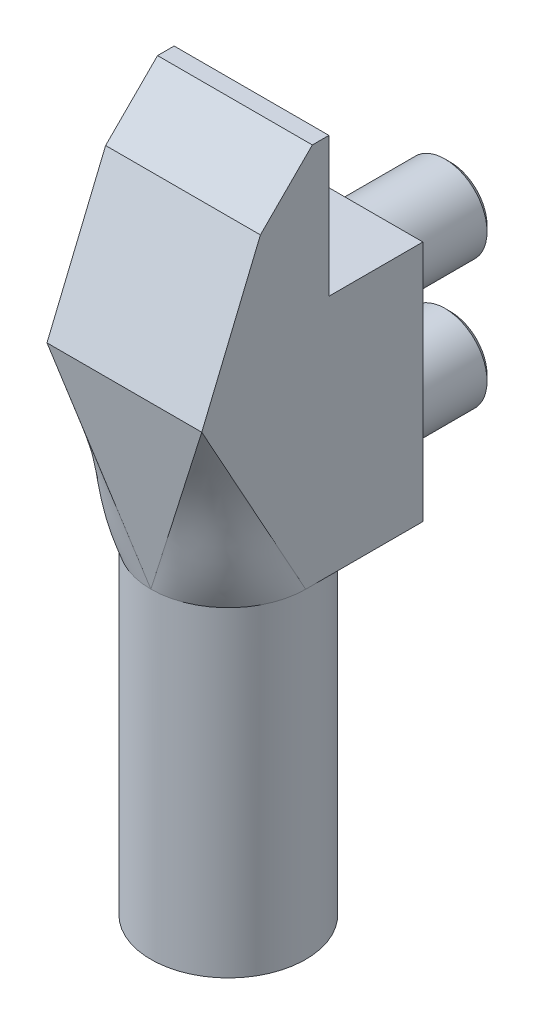
ISO-10303-21;
HEADER;
FILE_DESCRIPTION(('STEP AP214'),'2;1');
FILE_NAME('part.step','',(''),(''),'','','');
FILE_SCHEMA(('AUTOMOTIVE_DESIGN { 1 0 10303 214 1 1 1 1 }'));
ENDSEC;
DATA;
#1=APPLICATION_CONTEXT('core data for automotive mechanical design processes');
#2=APPLICATION_PROTOCOL_DEFINITION('international standard','automotive_design',2000,#1);
#3=PRODUCT_CONTEXT('',#1,'mechanical');
#4=PRODUCT('Part','Part','',(#3));
#5=PRODUCT_RELATED_PRODUCT_CATEGORY('part','',(#4));
#6=PRODUCT_DEFINITION_FORMATION('','',#4);
#7=PRODUCT_DEFINITION_CONTEXT('part definition',#1,'design');
#8=PRODUCT_DEFINITION('design','',#6,#7);
#9=PRODUCT_DEFINITION_SHAPE('','',#8);
#10=(LENGTH_UNIT() NAMED_UNIT(*) SI_UNIT(.MILLI.,.METRE.));
#11=(NAMED_UNIT(*) PLANE_ANGLE_UNIT() SI_UNIT($,.RADIAN.));
#12=(NAMED_UNIT(*) SI_UNIT($,.STERADIAN.) SOLID_ANGLE_UNIT());
#13=UNCERTAINTY_MEASURE_WITH_UNIT(LENGTH_MEASURE(1.E-05),#10,'distance_accuracy_value','');
#14=(GEOMETRIC_REPRESENTATION_CONTEXT(3) GLOBAL_UNCERTAINTY_ASSIGNED_CONTEXT((#13)) GLOBAL_UNIT_ASSIGNED_CONTEXT((#10,
#11,#12)) REPRESENTATION_CONTEXT('',''));
#15=CARTESIAN_POINT('',(0.,0.,0.));
#16=DIRECTION('',(0.,0.,1.));
#17=DIRECTION('',(1.,0.,0.));
#18=AXIS2_PLACEMENT_3D('',#15,#16,#17);
#19=CARTESIAN_POINT('',(7210.280501727,169.3631,8134.22260851004));
#20=DIRECTION('',(0.,0.,-1.));
#21=DIRECTION('',(-1.,0.,0.));
#22=AXIS2_PLACEMENT_3D('',#19,#20,#21);
#23=PLANE('',#22);
#24=CARTESIAN_POINT('',(7210.280501727,169.3631,8134.22260851002));
#25=DIRECTION('',(0.,0.,1.));
#26=DIRECTION('',(1.,0.,0.));
#27=AXIS2_PLACEMENT_3D('',#24,#25,#26);
#28=CIRCLE('',#27,0.838200000005784);
#29=CARTESIAN_POINT('',(7211.11870172701,169.3631,8134.22260851002));
#30=VERTEX_POINT('',#29);
#31=EDGE_CURVE('E26',#30,#30,#28,.T.);
#32=ORIENTED_EDGE('',*,*,#31,.F.);
#33=EDGE_LOOP('',(#32));
#34=FACE_BOUND('',#33,.T.);
#35=ADVANCED_FACE('F19',(#34),#23,.T.);
#36=CARTESIAN_POINT('',(7210.280501727,172.3349,8134.22260851004));
#37=DIRECTION('',(0.,0.,-1.));
#38=DIRECTION('',(-1.,0.,0.));
#39=AXIS2_PLACEMENT_3D('',#36,#37,#38);
#40=PLANE('',#39);
#41=CARTESIAN_POINT('',(7210.280501727,172.3349,8134.22260851002));
#42=DIRECTION('',(0.,0.,1.));
#43=DIRECTION('',(1.,0.,0.));
#44=AXIS2_PLACEMENT_3D('',#41,#42,#43);
#45=CIRCLE('',#44,0.838200000005784);
#46=CARTESIAN_POINT('',(7211.11870172701,172.3349,8134.22260851002));
#47=VERTEX_POINT('',#46);
#48=EDGE_CURVE('E104',#47,#47,#45,.T.);
#49=ORIENTED_EDGE('',*,*,#48,.F.);
#50=EDGE_LOOP('',(#49));
#51=FACE_BOUND('',#50,.T.);
#52=ADVANCED_FACE('F352',(#51),#40,.T.);
#53=CARTESIAN_POINT('',(7210.280501727,169.3631,8134.34960850992));
#54=DIRECTION('',(0.,0.,1.));
#55=DIRECTION('',(1.,0.,0.));
#56=AXIS2_PLACEMENT_3D('',#53,#54,#55);
#57=CONICAL_SURFACE('',#56,0.965199999912514,0.785398163397448);
#58=ORIENTED_EDGE('',*,*,#31,.T.);
#59=EDGE_LOOP('',(#58));
#60=FACE_BOUND('',#59,.T.);
#61=CARTESIAN_POINT('',(7210.280501727,169.3631,8134.34960851004));
#62=DIRECTION('',(0.,0.,-1.));
#63=DIRECTION('',(-1.,0.,0.));
#64=AXIS2_PLACEMENT_3D('',#61,#62,#63);
#65=CIRCLE('',#64,0.9652);
#66=CARTESIAN_POINT('',(7209.315301727,169.3631,8134.34960851004));
#67=VERTEX_POINT('',#66);
#68=EDGE_CURVE('E270',#67,#67,#65,.F.);
#69=ORIENTED_EDGE('',*,*,#68,.F.);
#70=EDGE_LOOP('',(#69));
#71=FACE_BOUND('',#70,.T.);
#72=ADVANCED_FACE('F348',(#60,#71),#57,.T.);
#73=CARTESIAN_POINT('',(7210.280501727,172.3349,8134.34960850992));
#74=DIRECTION('',(0.,0.,1.));
#75=DIRECTION('',(1.,0.,0.));
#76=AXIS2_PLACEMENT_3D('',#73,#74,#75);
#77=CONICAL_SURFACE('',#76,0.965199999912514,0.785398163397448);
#78=ORIENTED_EDGE('',*,*,#48,.T.);
#79=EDGE_LOOP('',(#78));
#80=FACE_BOUND('',#79,.T.);
#81=CARTESIAN_POINT('',(7210.280501727,172.3349,8134.34960851004));
#82=DIRECTION('',(0.,0.,-1.));
#83=DIRECTION('',(-1.,0.,0.));
#84=AXIS2_PLACEMENT_3D('',#81,#82,#83);
#85=CIRCLE('',#84,0.9652);
#86=CARTESIAN_POINT('',(7209.315301727,172.3349,8134.34960851004));
#87=VERTEX_POINT('',#86);
#88=EDGE_CURVE('E266',#87,#87,#85,.F.);
#89=ORIENTED_EDGE('',*,*,#88,.F.);
#90=EDGE_LOOP('',(#89));
#91=FACE_BOUND('',#90,.T.);
#92=ADVANCED_FACE('F434',(#80,#91),#77,.T.);
#93=CARTESIAN_POINT('',(7210.280501727,176.8815,8139.17560851004));
#94=DIRECTION('',(0.,-1.,0.));
#95=DIRECTION('',(0.,0.,-1.));
#96=AXIS2_PLACEMENT_3D('',#93,#94,#95);
#97=PLANE('',#96);
#98=DIRECTION('',(0.,0.,-1.));
#99=VECTOR('',#98,1.);
#100=CARTESIAN_POINT('',(7212.058501727,176.8815,8139.17560851004));
#101=LINE('',#100,#99);
#102=CARTESIAN_POINT('',(7212.058501727,176.8815,8138.79460851004));
#103=VERTEX_POINT('',#102);
#104=CARTESIAN_POINT('',(7212.058501727,176.8815,8139.17560851004));
#105=VERTEX_POINT('',#104);
#106=EDGE_CURVE('E103',#103,#105,#101,.F.);
#107=ORIENTED_EDGE('',*,*,#106,.F.);
#108=DIRECTION('',(-1.,0.,0.));
#109=VECTOR('',#108,1.);
#110=CARTESIAN_POINT('',(7210.280501727,176.8815,8138.79460851004));
#111=LINE('',#110,#109);
#112=CARTESIAN_POINT('',(7208.502501727,176.8815,8138.79460851004));
#113=VERTEX_POINT('',#112);
#114=EDGE_CURVE('E107',#113,#103,#111,.F.);
#115=ORIENTED_EDGE('',*,*,#114,.F.);
#116=DIRECTION('',(0.,0.,-1.));
#117=VECTOR('',#116,1.);
#118=CARTESIAN_POINT('',(7208.502501727,176.8815,8139.17560851004));
#119=LINE('',#118,#117);
#120=CARTESIAN_POINT('',(7208.502501727,176.8815,8139.17560851004));
#121=VERTEX_POINT('',#120);
#122=EDGE_CURVE('E92',#121,#113,#119,.T.);
#123=ORIENTED_EDGE('',*,*,#122,.F.);
#124=DIRECTION('',(1.,0.,0.));
#125=VECTOR('',#124,1.);
#126=CARTESIAN_POINT('',(7210.280501727,176.8815,8139.17560851004));
#127=LINE('',#126,#125);
#128=EDGE_CURVE('E127',#105,#121,#127,.F.);
#129=ORIENTED_EDGE('',*,*,#128,.F.);
#130=EDGE_LOOP('',(#107,#115,#123,#129));
#131=FACE_BOUND('',#130,.T.);
#132=ADVANCED_FACE('F108',(#131),#97,.F.);
#133=CARTESIAN_POINT('',(7210.280501727,175.6115,8140.44560851004));
#134=DIRECTION('',(0.,0.707106781186548,0.707106781186548));
#135=DIRECTION('',(0.,-0.707106781186548,0.707106781186548));
#136=AXIS2_PLACEMENT_3D('',#133,#134,#135);
#137=PLANE('',#136);
#138=ORIENTED_EDGE('',*,*,#128,.T.);
#139=DIRECTION('',(0.,-0.707106781186548,0.707106781186548));
#140=VECTOR('',#139,1.);
#141=CARTESIAN_POINT('',(7208.502501727,175.6115,8140.44560851004));
#142=LINE('',#141,#140);
#143=CARTESIAN_POINT('',(7208.502501727,175.68853841816,8140.36857009188));
#144=VERTEX_POINT('',#143);
#145=EDGE_CURVE('E99',#121,#144,#142,.T.);
#146=ORIENTED_EDGE('',*,*,#145,.T.);
#147=DIRECTION('',(1.,0.,0.));
#148=VECTOR('',#147,1.);
#149=CARTESIAN_POINT('',(7210.280501727,175.68853841816,8140.36857009188));
#150=LINE('',#149,#148);
#151=CARTESIAN_POINT('',(7212.058501727,175.68853841816,8140.36857009188));
#152=VERTEX_POINT('',#151);
#153=EDGE_CURVE('E112',#152,#144,#150,.F.);
#154=ORIENTED_EDGE('',*,*,#153,.F.);
#155=DIRECTION('',(0.,-0.707106781186548,0.707106781186548));
#156=VECTOR('',#155,1.);
#157=CARTESIAN_POINT('',(7212.058501727,175.6115,8140.44560851004));
#158=LINE('',#157,#156);
#159=EDGE_CURVE('E277',#152,#105,#158,.F.);
#160=ORIENTED_EDGE('',*,*,#159,.T.);
#161=EDGE_LOOP('',(#138,#146,#154,#160));
#162=FACE_BOUND('',#161,.T.);
#163=ADVANCED_FACE('F284',(#162),#137,.T.);
#164=CARTESIAN_POINT('',(7210.280501727,169.3631,8135.42910851004));
#165=DIRECTION('',(0.,0.,-1.));
#166=DIRECTION('',(-1.,0.,0.));
#167=AXIS2_PLACEMENT_3D('',#164,#165,#166);
#168=CYLINDRICAL_SURFACE('',#167,0.9652);
#169=ORIENTED_EDGE('',*,*,#68,.T.);
#170=EDGE_LOOP('',(#169));
#171=FACE_BOUND('',#170,.T.);
#172=CARTESIAN_POINT('',(7210.280501727,169.3631,8136.63560851004));
#173=DIRECTION('',(0.,0.,-1.));
#174=DIRECTION('',(-1.,0.,0.));
#175=AXIS2_PLACEMENT_3D('',#172,#173,#174);
#176=CIRCLE('',#175,0.9652);
#177=CARTESIAN_POINT('',(7209.315301727,169.3631,8136.63560851004));
#178=VERTEX_POINT('',#177);
#179=EDGE_CURVE('E257',#178,#178,#176,.T.);
#180=ORIENTED_EDGE('',*,*,#179,.T.);
#181=EDGE_LOOP('',(#180));
#182=FACE_BOUND('',#181,.T.);
#183=ADVANCED_FACE('F413',(#171,#182),#168,.T.);
#184=CARTESIAN_POINT('',(7210.280501727,172.3349,8135.42910851004));
#185=DIRECTION('',(0.,0.,-1.));
#186=DIRECTION('',(-1.,0.,0.));
#187=AXIS2_PLACEMENT_3D('',#184,#185,#186);
#188=CYLINDRICAL_SURFACE('',#187,0.9652);
#189=ORIENTED_EDGE('',*,*,#88,.T.);
#190=EDGE_LOOP('',(#189));
#191=FACE_BOUND('',#190,.T.);
#192=CARTESIAN_POINT('',(7210.280501727,172.3349,8136.63560851004));
#193=DIRECTION('',(0.,0.,-1.));
#194=DIRECTION('',(-1.,0.,0.));
#195=AXIS2_PLACEMENT_3D('',#192,#193,#194);
#196=CIRCLE('',#195,0.9652);
#197=CARTESIAN_POINT('',(7209.315301727,172.3349,8136.63560851004));
#198=VERTEX_POINT('',#197);
#199=EDGE_CURVE('E260',#198,#198,#196,.T.);
#200=ORIENTED_EDGE('',*,*,#199,.T.);
#201=EDGE_LOOP('',(#200));
#202=FACE_BOUND('',#201,.T.);
#203=ADVANCED_FACE('F406',(#191,#202),#188,.T.);
#204=CARTESIAN_POINT('',(7210.280501727,173.6811,8137.71510851004));
#205=DIRECTION('',(0.,-1.,0.));
#206=DIRECTION('',(0.,0.,-1.));
#207=AXIS2_PLACEMENT_3D('',#204,#205,#206);
#208=PLANE('',#207);
#209=DIRECTION('',(1.,0.,0.));
#210=VECTOR('',#209,1.);
#211=CARTESIAN_POINT('',(7210.280501727,173.6811,8136.63560851004));
#212=LINE('',#211,#210);
#213=CARTESIAN_POINT('',(7212.058501727,173.6811,8136.63560851004));
#214=VERTEX_POINT('',#213);
#215=CARTESIAN_POINT('',(7208.502501727,173.6811,8136.63560851004));
#216=VERTEX_POINT('',#215);
#217=EDGE_CURVE('E258',#214,#216,#212,.F.);
#218=ORIENTED_EDGE('',*,*,#217,.T.);
#219=DIRECTION('',(0.,0.,-1.));
#220=VECTOR('',#219,1.);
#221=CARTESIAN_POINT('',(7208.502501727,173.6811,8139.17560851004));
#222=LINE('',#221,#220);
#223=CARTESIAN_POINT('',(7208.502501727,173.6811,8138.79460851004));
#224=VERTEX_POINT('',#223);
#225=EDGE_CURVE('E118',#216,#224,#222,.F.);
#226=ORIENTED_EDGE('',*,*,#225,.T.);
#227=DIRECTION('',(-1.,0.,0.));
#228=VECTOR('',#227,1.);
#229=CARTESIAN_POINT('',(7210.280501727,173.6811,8138.79460851004));
#230=LINE('',#229,#228);
#231=CARTESIAN_POINT('',(7212.058501727,173.6811,8138.79460851004));
#232=VERTEX_POINT('',#231);
#233=EDGE_CURVE('E113',#232,#224,#230,.T.);
#234=ORIENTED_EDGE('',*,*,#233,.F.);
#235=DIRECTION('',(0.,0.,1.));
#236=VECTOR('',#235,1.);
#237=CARTESIAN_POINT('',(7212.058501727,173.6811,8139.17560851004));
#238=LINE('',#237,#236);
#239=EDGE_CURVE('E262',#232,#214,#238,.F.);
#240=ORIENTED_EDGE('',*,*,#239,.T.);
#241=EDGE_LOOP('',(#218,#226,#234,#240));
#242=FACE_BOUND('',#241,.T.);
#243=ADVANCED_FACE('F332',(#242),#208,.F.);
#244=CARTESIAN_POINT('',(7210.280501727,175.2813,8138.79460851004));
#245=DIRECTION('',(0.,0.,-1.));
#246=DIRECTION('',(-1.,0.,0.));
#247=AXIS2_PLACEMENT_3D('',#244,#245,#246);
#248=PLANE('',#247);
#249=DIRECTION('',(0.,1.,0.));
#250=VECTOR('',#249,1.);
#251=CARTESIAN_POINT('',(7208.502501727,172.5,8138.79460851004));
#252=LINE('',#251,#250);
#253=EDGE_CURVE('E98',#224,#113,#252,.T.);
#254=ORIENTED_EDGE('',*,*,#253,.T.);
#255=ORIENTED_EDGE('',*,*,#114,.T.);
#256=DIRECTION('',(0.,1.,0.));
#257=VECTOR('',#256,1.);
#258=CARTESIAN_POINT('',(7212.058501727,172.5,8138.79460851004));
#259=LINE('',#258,#257);
#260=EDGE_CURVE('E264',#103,#232,#259,.F.);
#261=ORIENTED_EDGE('',*,*,#260,.T.);
#262=ORIENTED_EDGE('',*,*,#233,.T.);
#263=EDGE_LOOP('',(#254,#255,#261,#262));
#264=FACE_BOUND('',#263,.T.);
#265=ADVANCED_FACE('F116',(#264),#248,.T.);
#266=CARTESIAN_POINT('',(7210.280501727,174.06251920908,8141.04208930096));
#267=DIRECTION('',(0.,0.38268343236509,0.923879532511287));
#268=DIRECTION('',(0.,-0.923879532511287,0.38268343236509));
#269=AXIS2_PLACEMENT_3D('',#266,#267,#268);
#270=PLANE('',#269);
#271=DIRECTION('',(0.,-0.923879532511304,0.382683432365049));
#272=VECTOR('',#271,1.);
#273=CARTESIAN_POINT('',(7208.502501727,175.68853841816,8140.36857009188));
#274=LINE('',#273,#272);
#275=CARTESIAN_POINT('',(7208.502501727,172.43649999988,8141.71560850997));
#276=VERTEX_POINT('',#275);
#277=EDGE_CURVE('E117',#144,#276,#274,.T.);
#278=ORIENTED_EDGE('',*,*,#277,.T.);
#279=DIRECTION('',(1.,0.,0.));
#280=VECTOR('',#279,1.);
#281=CARTESIAN_POINT('',(7209.518501727,172.4365,8141.71560851004));
#282=LINE('',#281,#280);
#283=CARTESIAN_POINT('',(7212.058501727,172.4365,8141.71560851004));
#284=VERTEX_POINT('',#283);
#285=EDGE_CURVE('E120',#284,#276,#282,.F.);
#286=ORIENTED_EDGE('',*,*,#285,.F.);
#287=DIRECTION('',(0.,0.923879532511304,-0.382683432365049));
#288=VECTOR('',#287,1.);
#289=CARTESIAN_POINT('',(7212.058501727,172.4365,8141.71560851004));
#290=LINE('',#289,#288);
#291=EDGE_CURVE('E259',#284,#152,#290,.T.);
#292=ORIENTED_EDGE('',*,*,#291,.T.);
#293=ORIENTED_EDGE('',*,*,#153,.T.);
#294=EDGE_LOOP('',(#278,#286,#292,#293));
#295=FACE_BOUND('',#294,.T.);
#296=ADVANCED_FACE('F287',(#295),#270,.T.);
#297=CARTESIAN_POINT('',(7210.280501727,172.5,8136.63560851004));
#298=DIRECTION('',(0.,0.,1.));
#299=DIRECTION('',(1.,0.,0.));
#300=AXIS2_PLACEMENT_3D('',#297,#298,#299);
#301=PLANE('',#300);
#302=DIRECTION('',(0.,1.,0.));
#303=VECTOR('',#302,1.);
#304=CARTESIAN_POINT('',(7212.058501727,172.5,8136.63560851004));
#305=LINE('',#304,#303);
#306=CARTESIAN_POINT('',(7212.058501727,168.1185,8136.63560851004));
#307=VERTEX_POINT('',#306);
#308=EDGE_CURVE('E251',#214,#307,#305,.F.);
#309=ORIENTED_EDGE('',*,*,#308,.T.);
#310=DIRECTION('',(1.,0.,0.));
#311=VECTOR('',#310,1.);
#312=CARTESIAN_POINT('',(7210.280501727,168.1185,8136.63560851004));
#313=LINE('',#312,#311);
#314=CARTESIAN_POINT('',(7208.502501727,168.1185,8136.63560851004));
#315=VERTEX_POINT('',#314);
#316=EDGE_CURVE('E238',#315,#307,#313,.T.);
#317=ORIENTED_EDGE('',*,*,#316,.F.);
#318=DIRECTION('',(0.,1.,0.));
#319=VECTOR('',#318,1.);
#320=CARTESIAN_POINT('',(7208.502501727,172.5,8136.63560851004));
#321=LINE('',#320,#319);
#322=EDGE_CURVE('E122',#315,#216,#321,.T.);
#323=ORIENTED_EDGE('',*,*,#322,.T.);
#324=ORIENTED_EDGE('',*,*,#217,.F.);
#325=EDGE_LOOP('',(#309,#317,#323,#324));
#326=FACE_BOUND('',#325,.T.);
#327=ORIENTED_EDGE('',*,*,#199,.F.);
#328=EDGE_LOOP('',(#327));
#329=FACE_BOUND('',#328,.T.);
#330=ORIENTED_EDGE('',*,*,#179,.F.);
#331=EDGE_LOOP('',(#330));
#332=FACE_BOUND('',#331,.T.);
#333=ADVANCED_FACE('F166',(#326,#329,#332),#301,.F.);
#334=CARTESIAN_POINT('',(7212.058501727,172.5,8139.17560851004));
#335=DIRECTION('',(-1.,0.,0.));
#336=DIRECTION('',(0.,0.,1.));
#337=AXIS2_PLACEMENT_3D('',#334,#335,#336);
#338=PLANE('',#337);
#339=DIRECTION('',(0.,0.,-1.));
#340=VECTOR('',#339,1.);
#341=CARTESIAN_POINT('',(7212.058501727,168.1185,8139.17560851004));
#342=LINE('',#341,#340);
#343=CARTESIAN_POINT('',(7212.058501727,168.1185,8139.32800851004));
#344=VERTEX_POINT('',#343);
#345=EDGE_CURVE('E241',#307,#344,#342,.F.);
#346=ORIENTED_EDGE('',*,*,#345,.F.);
#347=ORIENTED_EDGE('',*,*,#308,.F.);
#348=ORIENTED_EDGE('',*,*,#239,.F.);
#349=ORIENTED_EDGE('',*,*,#260,.F.);
#350=ORIENTED_EDGE('',*,*,#106,.T.);
#351=ORIENTED_EDGE('',*,*,#159,.F.);
#352=ORIENTED_EDGE('',*,*,#291,.F.);
#353=CARTESIAN_POINT('',(7212.058501727,168.1185,8139.32800851004));
#354=CARTESIAN_POINT('',(7212.05818407412,168.208348156806,8139.37791633752));
#355=CARTESIAN_POINT('',(7212.0580547823,168.298282896017,8139.42766761723));
#356=CARTESIAN_POINT('',(7212.05799962583,168.478278297973,8139.52702604191));
#357=CARTESIAN_POINT('',(7212.0580738412,168.568338996333,8139.57663312248));
#358=CARTESIAN_POINT('',(7212.05825239398,168.748481024138,8139.6758401108));
#359=CARTESIAN_POINT('',(7212.05835673565,168.838562354698,8139.72544001652));
#360=CARTESIAN_POINT('',(7212.05844548209,169.01844232934,8139.82497243019));
#361=CARTESIAN_POINT('',(7212.05842998756,169.108241147356,8139.87490462363));
#362=CARTESIAN_POINT('',(7212.05857345626,169.287746116251,8139.97490530111));
#363=CARTESIAN_POINT('',(7212.05873239474,169.377452278471,8140.02497376481));
#364=CARTESIAN_POINT('',(7212.05909376218,169.557237334267,8140.12464843413));
#365=CARTESIAN_POINT('',(7212.05929623411,169.647316509291,8140.17425413198));
#366=CARTESIAN_POINT('',(7212.0595346587,169.82755886959,8140.27343297653));
#367=CARTESIAN_POINT('',(7212.05957051769,169.917722073628,8140.32300608925));
#368=CARTESIAN_POINT('',(7212.05918204268,170.097771948155,8140.42229477853));
#369=CARTESIAN_POINT('',(7212.05875848036,170.187658828819,8140.47200997673));
#370=CARTESIAN_POINT('',(7212.05824466882,170.367447832217,8140.57166616505));
#371=CARTESIAN_POINT('',(7212.05815481592,170.457349846352,8140.62160735316));
#372=CARTESIAN_POINT('',(7212.05827862055,170.637388652072,8140.7212273933));
#373=CARTESIAN_POINT('',(7212.05849251057,170.72752557073,8140.77090601515));
#374=CARTESIAN_POINT('',(7212.05880433158,170.907587049381,8140.87027760832));
#375=CARTESIAN_POINT('',(7212.05890246373,170.997511705944,8140.9199704042));
#376=CARTESIAN_POINT('',(7212.05882945825,171.177289377412,8141.01934772761));
#377=CARTESIAN_POINT('',(7212.05865849507,171.267142400983,8141.06903223963));
#378=CARTESIAN_POINT('',(7212.05834497942,171.446845856923,8141.16837828903));
#379=CARTESIAN_POINT('',(7212.05820242325,171.536696288098,8141.21803982857));
#380=CARTESIAN_POINT('',(7212.05814379336,171.716505137076,8141.31735912374));
#381=CARTESIAN_POINT('',(7212.05822792407,171.806463579173,8141.36701683554));
#382=CARTESIAN_POINT('',(7212.05836895044,171.986437459085,8141.46647856002));
#383=CARTESIAN_POINT('',(7212.05842581399,172.076452839754,8141.51628267604));
#384=CARTESIAN_POINT('',(7212.05849823896,172.256476859705,8141.61593089513));
#385=CARTESIAN_POINT('',(7212.05851379497,172.346485496567,8141.66577500259));
#386=CARTESIAN_POINT('',(7212.058501727,172.4365,8141.71560851004));
#387=B_SPLINE_CURVE_WITH_KNOTS('',3,(#353,#354,#355,#356,#357,#358,#359,#360,#361,#362,#363,
#364,#365,#366,#367,#368,#369,#370,#371,#372,#373,#374,#375,#376,#377,#378,#379,#380,#381,#382,
#383,#384,#385,#386),.UNSPECIFIED.,.F.,.F.,(4,2,2,2,2,2,2,2,2,2,2,2,2,2,2,2,4),(0.,
0.30833628533791,0.616793842145121,0.9252950830123,1.23353709029005,1.5417353593611,
1.85023932142145,2.15891667879283,2.46707635914962,2.77560189216158,3.0843636988658,
3.3925881481097,3.70061287002708,4.00859734097839,4.31685965444148,4.62548401195804,
4.93414871831289),.UNSPECIFIED.);
#388=EDGE_CURVE('E224',#284,#344,#387,.F.);
#389=ORIENTED_EDGE('',*,*,#388,.T.);
#390=EDGE_LOOP('',(#346,#347,#348,#349,#350,#351,#352,#389));
#391=FACE_BOUND('',#390,.T.);
#392=ADVANCED_FACE('F160',(#391),#338,.F.);
#393=CARTESIAN_POINT('',(7208.502501727,172.5,8139.17560851004));
#394=DIRECTION('',(1.,0.,0.));
#395=DIRECTION('',(0.,0.,-1.));
#396=AXIS2_PLACEMENT_3D('',#393,#394,#395);
#397=PLANE('',#396);
#398=ORIENTED_EDGE('',*,*,#277,.F.);
#399=ORIENTED_EDGE('',*,*,#145,.F.);
#400=ORIENTED_EDGE('',*,*,#122,.T.);
#401=ORIENTED_EDGE('',*,*,#253,.F.);
#402=ORIENTED_EDGE('',*,*,#225,.F.);
#403=ORIENTED_EDGE('',*,*,#322,.F.);
#404=DIRECTION('',(0.,0.,-1.));
#405=VECTOR('',#404,1.);
#406=CARTESIAN_POINT('',(7208.502501727,168.1185,8139.17560851004));
#407=LINE('',#406,#405);
#408=CARTESIAN_POINT('',(7208.502501727,168.1185,8139.32800851004));
#409=VERTEX_POINT('',#408);
#410=EDGE_CURVE('E204',#409,#315,#407,.T.);
#411=ORIENTED_EDGE('',*,*,#410,.F.);
#412=CARTESIAN_POINT('',(7208.502501727,172.4365,8141.71560851004));
#413=CARTESIAN_POINT('',(7208.50248965903,172.346485496566,8141.66577500259));
#414=CARTESIAN_POINT('',(7208.50250521504,172.256476859704,8141.61593089513));
#415=CARTESIAN_POINT('',(7208.50257764001,172.076452839754,8141.51628267604));
#416=CARTESIAN_POINT('',(7208.50263450356,171.986437459086,8141.46647856002));
#417=CARTESIAN_POINT('',(7208.50277552993,171.806463579173,8141.36701683554));
#418=CARTESIAN_POINT('',(7208.50285966064,171.716505137076,8141.31735912374));
#419=CARTESIAN_POINT('',(7208.50280103075,171.536696288098,8141.21803982857));
#420=CARTESIAN_POINT('',(7208.50265847458,171.446845856923,8141.16837828903));
#421=CARTESIAN_POINT('',(7208.50234495893,171.267142400983,8141.06903223962));
#422=CARTESIAN_POINT('',(7208.50217399575,171.177289377412,8141.0193477276));
#423=CARTESIAN_POINT('',(7208.50210099027,170.997511705944,8140.91997040419));
#424=CARTESIAN_POINT('',(7208.50219912242,170.907587049382,8140.87027760831));
#425=CARTESIAN_POINT('',(7208.50251094343,170.72752557073,8140.77090601514));
#426=CARTESIAN_POINT('',(7208.50272483345,170.637388652072,8140.7212273933));
#427=CARTESIAN_POINT('',(7208.50284863808,170.457349846351,8140.62160735316));
#428=CARTESIAN_POINT('',(7208.50275878518,170.367447832218,8140.57166616505));
#429=CARTESIAN_POINT('',(7208.50224497364,170.18765882882,8140.47200997673));
#430=CARTESIAN_POINT('',(7208.50182141132,170.097771948155,8140.42229477853));
#431=CARTESIAN_POINT('',(7208.50143293631,169.917722073627,8140.32300608925));
#432=CARTESIAN_POINT('',(7208.50146879531,169.82755886959,8140.27343297653));
#433=CARTESIAN_POINT('',(7208.50170721989,169.647316509291,8140.17425413198));
#434=CARTESIAN_POINT('',(7208.50190969182,169.557237334267,8140.12464843413));
#435=CARTESIAN_POINT('',(7208.50227105926,169.377452278471,8140.02497376481));
#436=CARTESIAN_POINT('',(7208.50242999774,169.287746116252,8139.97490530111));
#437=CARTESIAN_POINT('',(7208.50257346644,169.108241147356,8139.87490462363));
#438=CARTESIAN_POINT('',(7208.50255797191,169.018442329339,8139.82497243019));
#439=CARTESIAN_POINT('',(7208.50264671835,168.838562354698,8139.72544001652));
#440=CARTESIAN_POINT('',(7208.50275106002,168.748481024138,8139.67584011079));
#441=CARTESIAN_POINT('',(7208.5029296128,168.568338996333,8139.57663312248));
#442=CARTESIAN_POINT('',(7208.50300382817,168.478278297973,8139.52702604191));
#443=CARTESIAN_POINT('',(7208.5029486717,168.298282896016,8139.42766761723));
#444=CARTESIAN_POINT('',(7208.50281937989,168.208348156806,8139.37791633752));
#445=CARTESIAN_POINT('',(7208.502501727,168.1185,8139.32800851004));
#446=B_SPLINE_CURVE_WITH_KNOTS('',3,(#412,#413,#414,#415,#416,#417,#418,#419,#420,#421,#422,
#423,#424,#425,#426,#427,#428,#429,#430,#431,#432,#433,#434,#435,#436,#437,#438,#439,#440,#441,
#442,#443,#444,#445),.UNSPECIFIED.,.F.,.F.,(4,2,2,2,2,2,2,2,2,2,2,2,2,2,2,2,4),(0.,
0.308664706354033,0.617289063871358,0.925551377333564,1.23353584828571,1.541560570204,
1.8497850194479,2.15854682615045,2.46707235916408,2.77523203951917,3.08390939689058,
3.39241335895093,3.70061162802284,4.00885363529978,4.31735487616779,4.62581243297417,
4.93414871831203),.UNSPECIFIED.);
#447=EDGE_CURVE('E143',#409,#276,#446,.F.);
#448=ORIENTED_EDGE('',*,*,#447,.T.);
#449=EDGE_LOOP('',(#398,#399,#400,#401,#402,#403,#411,#448));
#450=FACE_BOUND('',#449,.T.);
#451=ADVANCED_FACE('F95',(#450),#397,.F.);
#452=CARTESIAN_POINT('',(7209.518501727,170.2775,8141.41080851004));
#453=DIRECTION('',(0.,-0.139790277749515,0.990181134059175));
#454=DIRECTION('',(0.,-0.990181134059175,-0.139790277749515));
#455=AXIS2_PLACEMENT_3D('',#452,#453,#454);
#456=PLANE('',#455);
#457=ORIENTED_EDGE('',*,*,#285,.T.);
#458=CARTESIAN_POINT('',(7210.280501727,168.1185,8141.10600851004));
#459=CARTESIAN_POINT('',(7210.24326516917,168.208380415817,8141.11837989597));
#460=CARTESIAN_POINT('',(7210.20621297942,168.298309200684,8141.13094642323));
#461=CARTESIAN_POINT('',(7210.13227046073,168.478292690997,8141.15630062907));
#462=CARTESIAN_POINT('',(7210.09538029522,168.568347438612,8141.16908848573));
#463=CARTESIAN_POINT('',(7210.02161153202,168.748474029651,8141.19469670073));
#464=CARTESIAN_POINT('',(7209.98473293707,168.838545873532,8141.20751706389));
#465=CARTESIAN_POINT('',(7209.91059513609,169.018426050423,8141.23300062246));
#466=CARTESIAN_POINT('',(7209.87333644185,169.108234570139,8141.24566398853));
#467=CARTESIAN_POINT('',(7209.79867024179,169.287757664684,8141.27115192908));
#468=CARTESIAN_POINT('',(7209.76126274911,169.377472246969,8141.28397648951));
#469=CARTESIAN_POINT('',(7209.68697069936,169.557253966857,8141.30971877253));
#470=CARTESIAN_POINT('',(7209.65008694744,169.647321422152,8141.32263660038));
#471=CARTESIAN_POINT('',(7209.57636336907,169.827541409633,8141.34831788876));
#472=CARTESIAN_POINT('',(7209.5395235678,169.917693961689,8141.36108128171));
#473=CARTESIAN_POINT('',(7209.46565103783,170.097749973974,8141.3861123321));
#474=CARTESIAN_POINT('',(7209.42861892339,170.187653541009,8141.39838103255));
#475=CARTESIAN_POINT('',(7209.35433493163,170.367466519059,8141.42325259413));
#476=CARTESIAN_POINT('',(7209.31708282677,170.457375777347,8141.43585587988));
#477=CARTESIAN_POINT('',(7209.24288311512,170.637406787433,8141.4613957503));
#478=CARTESIAN_POINT('',(7209.20593594949,170.727528664288,8141.47433273368));
#479=CARTESIAN_POINT('',(7209.1319917334,170.907573376877,8141.50006265023));
#480=CARTESIAN_POINT('',(7209.09499490314,170.997496271337,8141.51285580637));
#481=CARTESIAN_POINT('',(7209.02099595797,171.177278770322,8141.53816381581));
#482=CARTESIAN_POINT('',(7208.98399388052,171.267138355152,8141.55067891876));
#483=CARTESIAN_POINT('',(7208.91001320095,171.446852832963,8141.57573687266));
#484=CARTESIAN_POINT('',(7208.87303459687,171.536707725541,8141.58827972078));
#485=CARTESIAN_POINT('',(7208.7991012406,171.716513735497,8141.61360543809));
#486=CARTESIAN_POINT('',(7208.76214656206,171.806464847382,8141.62638856149));
#487=CARTESIAN_POINT('',(7208.68809567023,171.986432027549,8141.65193672878));
#488=CARTESIAN_POINT('',(7208.6509993443,172.076448054624,8141.66470173602));
#489=CARTESIAN_POINT('',(7208.57676575315,172.25647336683,8141.69018949211));
#490=CARTESIAN_POINT('',(7208.53962848639,172.346482651565,8141.70291223931));
#491=CARTESIAN_POINT('',(7208.502501727,172.4365,8141.71560851004));
#492=B_SPLINE_CURVE_WITH_KNOTS('',3,(#458,#459,#460,#461,#462,#463,#464,#465,#466,#467,#468,
#469,#470,#471,#472,#473,#474,#475,#476,#477,#478,#479,#480,#481,#482,#483,#484,#485,#486,#487,
#488,#489,#490,#491),.UNSPECIFIED.,.F.,.F.,(4,2,2,2,2,2,2,2,2,2,2,2,2,2,2,2,4),(0.,
0.29421390364708,0.588676669137764,0.883185874584891,1.17734044082607,1.47146956116692,
1.76601032966512,2.06067563334693,2.35468316258371,2.64908356833889,2.94385370734711,
3.2380762142242,3.53202290268878,3.82594076657192,4.12018935644055,4.41476991470904,
4.7093618921189),.UNSPECIFIED.);
#493=CARTESIAN_POINT('',(7210.280501727,168.1185,8141.10600851004));
#494=VERTEX_POINT('',#493);
#495=EDGE_CURVE('E42',#276,#494,#492,.F.);
#496=ORIENTED_EDGE('',*,*,#495,.T.);
#497=CARTESIAN_POINT('',(7212.058501727,172.4365,8141.71560851004));
#498=CARTESIAN_POINT('',(7212.02137496761,172.346482651565,8141.70291223932));
#499=CARTESIAN_POINT('',(7211.98423770085,172.25647336683,8141.69018949211));
#500=CARTESIAN_POINT('',(7211.91000410969,172.076448054624,8141.66470173602));
#501=CARTESIAN_POINT('',(7211.87290778377,171.986432027549,8141.65193672878));
#502=CARTESIAN_POINT('',(7211.79885689194,171.806464847382,8141.62638856149));
#503=CARTESIAN_POINT('',(7211.7619022134,171.716513735497,8141.61360543809));
#504=CARTESIAN_POINT('',(7211.68796885713,171.536707725541,8141.58827972078));
#505=CARTESIAN_POINT('',(7211.65099025305,171.446852832964,8141.57573687266));
#506=CARTESIAN_POINT('',(7211.57700957348,171.267138355152,8141.55067891876));
#507=CARTESIAN_POINT('',(7211.54000749603,171.177278770322,8141.53816381581));
#508=CARTESIAN_POINT('',(7211.46600855086,170.997496271337,8141.51285580637));
#509=CARTESIAN_POINT('',(7211.4290117206,170.907573376878,8141.50006265023));
#510=CARTESIAN_POINT('',(7211.35506750451,170.727528664288,8141.47433273368));
#511=CARTESIAN_POINT('',(7211.31812033888,170.637406787433,8141.46139575031));
#512=CARTESIAN_POINT('',(7211.24392062723,170.457375777347,8141.43585587988));
#513=CARTESIAN_POINT('',(7211.20666852238,170.367466519059,8141.42325259413));
#514=CARTESIAN_POINT('',(7211.13238453061,170.187653541009,8141.39838103255));
#515=CARTESIAN_POINT('',(7211.09535241616,170.097749973974,8141.3861123321));
#516=CARTESIAN_POINT('',(7211.0214798862,169.917693961689,8141.36108128171));
#517=CARTESIAN_POINT('',(7210.98464008493,169.827541409633,8141.34831788876));
#518=CARTESIAN_POINT('',(7210.91091650656,169.647321422152,8141.32263660038));
#519=CARTESIAN_POINT('',(7210.87403275464,169.557253966857,8141.30971877253));
#520=CARTESIAN_POINT('',(7210.79974070489,169.377472246969,8141.28397648951));
#521=CARTESIAN_POINT('',(7210.76233321221,169.287757664685,8141.27115192908));
#522=CARTESIAN_POINT('',(7210.68766701215,169.108234570139,8141.24566398853));
#523=CARTESIAN_POINT('',(7210.65040831791,169.018426050423,8141.23300062246));
#524=CARTESIAN_POINT('',(7210.57627051693,168.838545873532,8141.20751706389));
#525=CARTESIAN_POINT('',(7210.53939192198,168.748474029651,8141.19469670073));
#526=CARTESIAN_POINT('',(7210.46562315878,168.568347438612,8141.16908848572));
#527=CARTESIAN_POINT('',(7210.42873299327,168.478292690997,8141.15630062907));
#528=CARTESIAN_POINT('',(7210.35479047458,168.298309200684,8141.13094642322));
#529=CARTESIAN_POINT('',(7210.31773828483,168.208380415818,8141.11837989597));
#530=CARTESIAN_POINT('',(7210.280501727,168.1185,8141.10600851004));
#531=B_SPLINE_CURVE_WITH_KNOTS('',3,(#497,#498,#499,#500,#501,#502,#503,#504,#505,#506,#507,
#508,#509,#510,#511,#512,#513,#514,#515,#516,#517,#518,#519,#520,#521,#522,#523,#524,#525,#526,
#527,#528,#529,#530),.UNSPECIFIED.,.F.,.F.,(4,2,2,2,2,2,2,2,2,2,2,2,2,2,2,2,4),(0.,
0.294591977410245,0.589172535678583,0.883421125546776,1.17733898943025,1.47128567789447,
1.76550818477161,2.06027832377944,2.3546787295349,2.6486862587725,2.94335156245369,
3.23789233095187,3.53202145129275,3.82617601753356,4.12068522298068,4.4151479884715,
4.70936189211812),.UNSPECIFIED.);
#532=EDGE_CURVE('E243',#494,#284,#531,.F.);
#533=ORIENTED_EDGE('',*,*,#532,.T.);
#534=EDGE_LOOP('',(#457,#496,#533));
#535=FACE_BOUND('',#534,.T.);
#536=ADVANCED_FACE('F159',(#535),#456,.T.);
#537=CARTESIAN_POINT('',(7210.280501727,168.1185,8139.17560851004));
#538=DIRECTION('',(0.,-1.,0.));
#539=DIRECTION('',(0.,0.,-1.));
#540=AXIS2_PLACEMENT_3D('',#537,#538,#539);
#541=PLANE('',#540);
#542=ORIENTED_EDGE('',*,*,#316,.T.);
#543=ORIENTED_EDGE('',*,*,#345,.T.);
#544=CARTESIAN_POINT('',(7210.280501727,168.1185,8139.32800851004));
#545=DIRECTION('',(0.,-1.,0.));
#546=DIRECTION('',(0.,0.,-1.));
#547=AXIS2_PLACEMENT_3D('',#544,#545,#546);
#548=CIRCLE('',#547,1.778);
#549=EDGE_CURVE('E229',#409,#344,#548,.T.);
#550=ORIENTED_EDGE('',*,*,#549,.F.);
#551=ORIENTED_EDGE('',*,*,#410,.T.);
#552=EDGE_LOOP('',(#542,#543,#550,#551));
#553=FACE_BOUND('',#552,.T.);
#554=ADVANCED_FACE('F303',(#553),#541,.T.);
#555=CARTESIAN_POINT('',(7212.74502339678,172.4365,8140.74471285934));
#556=CARTESIAN_POINT('',(7212.72216558269,172.430006818777,8140.8418005087));
#557=CARTESIAN_POINT('',(7212.67644995452,172.41702045633,8141.03597580741));
#558=CARTESIAN_POINT('',(7212.50725250345,172.446488903057,8141.28982425345));
#559=CARTESIAN_POINT('',(7212.27895206599,172.433753261282,8141.49062483906));
#560=CARTESIAN_POINT('',(7212.05953811628,172.437873369359,8141.71683878676));
#561=CARTESIAN_POINT('',(7211.83390583089,172.433753261282,8141.93567107415));
#562=CARTESIAN_POINT('',(7211.63130727234,172.446488903057,8142.16576948457));
#563=CARTESIAN_POINT('',(7211.3816190776,172.41702045633,8142.33080668434));
#564=CARTESIAN_POINT('',(7211.18561041006,172.430006818777,8142.37835568133));
#565=CARTESIAN_POINT('',(7211.0876060763,172.4365,8142.40213017982));
#566=CARTESIAN_POINT('',(7212.66106354922,172.250880903332,8140.70881065965));
#567=CARTESIAN_POINT('',(7212.64378908077,172.246135192791,8140.80118537767));
#568=CARTESIAN_POINT('',(7212.60923560787,172.23664286381,8140.98593435967));
#569=CARTESIAN_POINT('',(7212.45601326954,172.266102435284,8141.2280557372));
#570=CARTESIAN_POINT('',(7212.24137609211,172.255141749918,8141.42742493044));
#571=CARTESIAN_POINT('',(7212.02286565121,172.257304125041,8141.65467419308));
#572=CARTESIAN_POINT('',(7211.79592166506,172.255141749918,8141.8728793575));
#573=CARTESIAN_POINT('',(7211.59500508094,172.266102435284,8142.0890639258));
#574=CARTESIAN_POINT('',(7211.35704270174,172.23664286381,8142.2381272658));
#575=CARTESIAN_POINT('',(7211.17095362624,172.246135192791,8142.27402083221));
#576=CARTESIAN_POINT('',(7211.07790892555,172.250880903332,8142.29196528332));
#577=CARTESIAN_POINT('',(7212.49314385411,171.879642709997,8140.63700626027));
#578=CARTESIAN_POINT('',(7212.48703607693,171.87839194082,8140.71995511563));
#579=CARTESIAN_POINT('',(7212.47481221968,171.875890553067,8140.88585717508));
#580=CARTESIAN_POINT('',(7212.35351623386,171.905319439701,8141.10449871658));
#581=CARTESIAN_POINT('',(7212.16629311072,171.897956093039,8141.30109935476));
#582=CARTESIAN_POINT('',(7211.94926342349,171.896026233049,8141.53006802767));
#583=CARTESIAN_POINT('',(7211.72002229976,171.897956093039,8141.74737016572));
#584=CARTESIAN_POINT('',(7211.52238213029,171.905319439701,8141.93563282015));
#585=CARTESIAN_POINT('',(7211.30789525513,171.875890553067,8142.05277413962));
#586=CARTESIAN_POINT('',(7211.14164005859,171.87839194082,8142.06535113397));
#587=CARTESIAN_POINT('',(7211.05851462405,171.879642709997,8142.07163549033));
#588=CARTESIAN_POINT('',(7212.43431226478,171.39483203016,8140.3457429898));
#589=CARTESIAN_POINT('',(7212.41640925263,171.38494424091,8140.44209846171));
#590=CARTESIAN_POINT('',(7212.38063909249,171.365169497157,8140.6347948661));
#591=CARTESIAN_POINT('',(7212.2407679719,171.366199224375,8140.886151575));
#592=CARTESIAN_POINT('',(7212.06163650681,171.358138405531,8141.11478198893));
#593=CARTESIAN_POINT('',(7211.84642119458,171.348379478953,8141.34991096288));
#594=CARTESIAN_POINT('',(7211.60991448982,171.358138405531,8141.56650400592));
#595=CARTESIAN_POINT('',(7211.38014607793,171.366199224375,8141.74677346897));
#596=CARTESIAN_POINT('',(7211.12893474229,171.365169497157,8141.8864992163));
#597=CARTESIAN_POINT('',(7210.93344660936,171.38494424091,8141.92506110498));
#598=CARTESIAN_POINT('',(7210.83569521427,171.39483203016,8141.94436004032));
#599=CARTESIAN_POINT('',(7212.2076922828,170.715602625302,8140.17539615779));
#600=CARTESIAN_POINT('',(7212.21252734754,170.735923948118,8140.26445612027));
#601=CARTESIAN_POINT('',(7212.22206232336,170.776563104154,8140.44262985417));
#602=CARTESIAN_POINT('',(7212.1359926703,170.82626789642,8140.68888861069));
#603=CARTESIAN_POINT('',(7211.97571631543,170.811140839404,8140.94364591687));
#604=CARTESIAN_POINT('',(7211.76431136494,170.799469399244,8141.19030794553));
#605=CARTESIAN_POINT('',(7211.51600160357,170.811140839404,8141.40336062874));
#606=CARTESIAN_POINT('',(7211.25910871286,170.82626789642,8141.56577256813));
#607=CARTESIAN_POINT('',(7211.01986710348,170.776563104154,8141.64482507404));
#608=CARTESIAN_POINT('',(7210.84743066221,170.735923948118,8141.6295528056));
#609=CARTESIAN_POINT('',(7210.76123959236,170.715602625301,8141.62184884823));
#610=CARTESIAN_POINT('',(7212.168318666,170.271441135258,8139.91908869011));
#611=CARTESIAN_POINT('',(7212.16192420452,170.272078461611,8140.02338238398));
#612=CARTESIAN_POINT('',(7212.14964003211,170.273366237951,8140.23176907541));
#613=CARTESIAN_POINT('',(7212.06205637682,170.281289894252,8140.51465121155));
#614=CARTESIAN_POINT('',(7211.92145357389,170.267754688097,8140.80339637464));
#615=CARTESIAN_POINT('',(7211.7153307407,170.258359942749,8141.06493539801));
#616=CARTESIAN_POINT('',(7211.45246540034,170.267754688097,8141.27238454819));
#617=CARTESIAN_POINT('',(7211.16180938462,170.281289894252,8141.41489820375));
#618=CARTESIAN_POINT('',(7210.8800458823,170.273366237951,8141.50136322521));
#619=CARTESIAN_POINT('',(7210.67184099459,170.272078461611,8141.51346559391));
#620=CARTESIAN_POINT('',(7210.56763727621,170.271441135258,8141.5197700799));
#621=CARTESIAN_POINT('',(7212.06340373805,169.708657670841,8139.76082837625));
#622=CARTESIAN_POINT('',(7212.07296823567,169.716813521774,8139.86023438253));
#623=CARTESIAN_POINT('',(7212.09021338243,169.733076218701,8140.05979537143));
#624=CARTESIAN_POINT('',(7212.02409576534,169.740898307249,8140.37766440741));
#625=CARTESIAN_POINT('',(7211.90043995513,169.735433010841,8140.69774196152));
#626=CARTESIAN_POINT('',(7211.69861278212,169.73152650519,8140.97384095413));
#627=CARTESIAN_POINT('',(7211.42196228284,169.735433010841,8141.17621963382));
#628=CARTESIAN_POINT('',(7211.10111315747,169.740898307249,8141.30064701528));
#629=CARTESIAN_POINT('',(7210.78434841634,169.733076218701,8141.36566033752));
#630=CARTESIAN_POINT('',(7210.58708333759,169.716813521774,8141.3461192806));
#631=CARTESIAN_POINT('',(7210.48882874556,169.708657670841,8141.33540336874));
#632=CARTESIAN_POINT('',(7212.06162801844,169.194163271287,8139.58077103995));
#633=CARTESIAN_POINT('',(7212.0611922368,169.195777147348,8139.69452600699));
#634=CARTESIAN_POINT('',(7212.06735131686,169.1991877956,8139.919240732));
#635=CARTESIAN_POINT('',(7212.01210220467,169.204945411624,8140.26797646792));
#636=CARTESIAN_POINT('',(7211.89197389228,169.207229588961,8140.60543190043));
#637=CARTESIAN_POINT('',(7211.68880050642,169.207753794899,8140.8900842958));
#638=CARTESIAN_POINT('',(7211.40422211659,169.207229588961,8141.09318367612));
#639=CARTESIAN_POINT('',(7211.06708915618,169.204945411624,8141.21298951641));
#640=CARTESIAN_POINT('',(7210.71916626017,169.1991877956,8141.26742578869));
#641=CARTESIAN_POINT('',(7210.49493303844,169.195777147348,8141.26078520535));
#642=CARTESIAN_POINT('',(7210.38140591273,169.194163271287,8141.26099314566));
#643=CARTESIAN_POINT('',(7212.04855510899,168.657067049716,8139.45382718826));
#644=CARTESIAN_POINT('',(7212.06126600084,168.658425920465,8139.5662696878));
#645=CARTESIAN_POINT('',(7212.06044905959,168.66046108239,8139.8015865468));
#646=CARTESIAN_POINT('',(7211.99481582931,168.663788306591,8140.15601697313));
#647=CARTESIAN_POINT('',(7211.858974088,168.666228590666,8140.48913142106));
#648=CARTESIAN_POINT('',(7211.64701534133,168.667206271979,8140.77198653924));
#649=CARTESIAN_POINT('',(7211.36429824875,168.666228590666,8140.98380726031));
#650=CARTESIAN_POINT('',(7211.03152831152,168.663788306591,8141.11930449092));
#651=CARTESIAN_POINT('',(7210.67756761095,168.66046108239,8141.18446799544));
#652=CARTESIAN_POINT('',(7210.44253806893,168.658425920465,8141.18499761971));
#653=CARTESIAN_POINT('',(7210.33028740996,168.657067049716,8141.17209488729));
#654=CARTESIAN_POINT('',(7212.058501727,168.298416666667,8139.36930692943));
#655=CARTESIAN_POINT('',(7212.06230992071,168.298416666667,8139.48567675731));
#656=CARTESIAN_POINT('',(7212.04783026747,168.298416666667,8139.72027342003));
#657=CARTESIAN_POINT('',(7211.95914048016,168.298416666667,8140.06347834413));
#658=CARTESIAN_POINT('',(7211.80365330341,168.298416666667,8140.38141667435));
#659=CARTESIAN_POINT('',(7211.58412807724,168.298416666667,8140.65703486028));
#660=CARTESIAN_POINT('',(7211.30850989131,168.298416666667,8140.87656008645));
#661=CARTESIAN_POINT('',(7210.99057156109,168.298416666667,8141.0320472632));
#662=CARTESIAN_POINT('',(7210.64736663699,168.298416666667,8141.12073705051));
#663=CARTESIAN_POINT('',(7210.41276997427,168.298416666667,8141.13521670375));
#664=CARTESIAN_POINT('',(7210.2964001464,168.298416666667,8141.13140851004));
#665=CARTESIAN_POINT('',(7212.058501727,168.1185,8139.32800851004));
#666=CARTESIAN_POINT('',(7212.058501727,168.1185,8139.44437833792));
#667=CARTESIAN_POINT('',(7212.03557906167,168.1185,8139.67711464963));
#668=CARTESIAN_POINT('',(7211.93374842701,168.1185,8140.01280583492));
#669=CARTESIAN_POINT('',(7211.76838444512,168.1185,8140.3221799274));
#670=CARTESIAN_POINT('',(7211.54584197856,168.1185,8140.5933487616));
#671=CARTESIAN_POINT('',(7211.27467314435,168.1185,8140.81589122816));
#672=CARTESIAN_POINT('',(7210.96529905188,168.1185,8140.98125521005));
#673=CARTESIAN_POINT('',(7210.62960786659,168.1185,8141.08308584471));
#674=CARTESIAN_POINT('',(7210.39687155488,168.1185,8141.10600851004));
#675=CARTESIAN_POINT('',(7210.280501727,168.1185,8141.10600851004));
#676=B_SPLINE_SURFACE_WITH_KNOTS('',3,3,((#555,#556,#557,#558,#559,#560,#561,#562,#563,#564,
#565),(#566,#567,#568,#569,#570,#571,#572,#573,#574,#575,#576),(#577,#578,#579,#580,#581,#582,
#583,#584,#585,#586,#587),(#588,#589,#590,#591,#592,#593,#594,#595,#596,#597,#598),(#599,#600,
#601,#602,#603,#604,#605,#606,#607,#608,#609),(#610,#611,#612,#613,#614,#615,#616,#617,#618,
#619,#620),(#621,#622,#623,#624,#625,#626,#627,#628,#629,#630,#631),(#632,#633,#634,#635,#636,
#637,#638,#639,#640,#641,#642),(#643,#644,#645,#646,#647,#648,#649,#650,#651,#652,#653),(#654,
#655,#656,#657,#658,#659,#660,#661,#662,#663,#664),(#665,#666,#667,#668,#669,#670,#671,#672,
#673,#674,#675)),.UNSPECIFIED.,.F.,.F.,.F.,(4,1,1,1,1,1,1,1,4),(4,1,1,1,1,1,1,1,4),
(-2.00000000000001,-1.62500000000001,-1.25000000000001,-0.875000000000005,-0.500000000000004,
-0.125000000000003,0.249999999999998,0.624999999999999,1.),(-1.73205080756889,-1.29903810567666,
-0.866025403784443,-0.433012701892222,0.,0.433012701892221,0.866025403784443,1.29903810567667,
1.73205080756889),.UNSPECIFIED.);
#677=CARTESIAN_POINT('',(7210.280501727,168.1185,8139.32800851004));
#678=DIRECTION('',(0.,-1.,0.));
#679=DIRECTION('',(0.,0.,-1.));
#680=AXIS2_PLACEMENT_3D('',#677,#678,#679);
#681=CIRCLE('',#680,1.778);
#682=EDGE_CURVE('E189',#344,#494,#681,.T.);
#683=ORIENTED_EDGE('',*,*,#388,.F.);
#684=ORIENTED_EDGE('',*,*,#532,.F.);
#685=ORIENTED_EDGE('',*,*,#682,.F.);
#686=EDGE_LOOP('',(#683,#684,#685));
#687=FACE_BOUND('',#686,.T.);
#688=ADVANCED_FACE('F292',(#687),#676,.F.);
#689=CARTESIAN_POINT('',(7209.4733973777,172.4365,8142.40213017982));
#690=CARTESIAN_POINT('',(7209.37539304394,172.430006818777,8142.37835568133));
#691=CARTESIAN_POINT('',(7209.1793843764,172.41702045633,8142.33080668434));
#692=CARTESIAN_POINT('',(7208.92969618167,172.446488903057,8142.16576948457));
#693=CARTESIAN_POINT('',(7208.72709762311,172.433753261282,8141.93567107415));
#694=CARTESIAN_POINT('',(7208.50146533772,172.437873369359,8141.71683878676));
#695=CARTESIAN_POINT('',(7208.28205138801,172.433753261282,8141.49062483906));
#696=CARTESIAN_POINT('',(7208.05375095055,172.446488903057,8141.28982425345));
#697=CARTESIAN_POINT('',(7207.88455349948,172.41702045633,8141.03597580741));
#698=CARTESIAN_POINT('',(7207.83883787131,172.430006818777,8140.8418005087));
#699=CARTESIAN_POINT('',(7207.81598005722,172.4365,8140.74471285934));
#700=CARTESIAN_POINT('',(7209.48309452845,172.250880903332,8142.29196528332));
#701=CARTESIAN_POINT('',(7209.39004982776,172.246135192791,8142.27402083221));
#702=CARTESIAN_POINT('',(7209.20396075226,172.23664286381,8142.2381272658));
#703=CARTESIAN_POINT('',(7208.96599837306,172.266102435284,8142.0890639258));
#704=CARTESIAN_POINT('',(7208.76508178894,172.255141749918,8141.8728793575));
#705=CARTESIAN_POINT('',(7208.5381378028,172.257304125041,8141.65467419308));
#706=CARTESIAN_POINT('',(7208.31962736189,172.255141749918,8141.42742493044));
#707=CARTESIAN_POINT('',(7208.10499018446,172.266102435284,8141.2280557372));
#708=CARTESIAN_POINT('',(7207.95176784613,172.23664286381,8140.98593435967));
#709=CARTESIAN_POINT('',(7207.91721437323,172.246135192791,8140.80118537768));
#710=CARTESIAN_POINT('',(7207.89993990478,172.250880903332,8140.70881065965));
#711=CARTESIAN_POINT('',(7209.50248882995,171.879642709997,8142.07163549032));
#712=CARTESIAN_POINT('',(7209.41936339541,171.87839194082,8142.06535113397));
#713=CARTESIAN_POINT('',(7209.25310819887,171.875890553067,8142.05277413962));
#714=CARTESIAN_POINT('',(7209.03862132372,171.905319439701,8141.93563282015));
#715=CARTESIAN_POINT('',(7208.84098115424,171.897956093039,8141.74737016572));
#716=CARTESIAN_POINT('',(7208.61174003051,171.896026233049,8141.53006802767));
#717=CARTESIAN_POINT('',(7208.39471034328,171.897956093039,8141.30109935476));
#718=CARTESIAN_POINT('',(7208.20748722015,171.905319439701,8141.10449871658));
#719=CARTESIAN_POINT('',(7208.08619123433,171.875890553067,8140.88585717508));
#720=CARTESIAN_POINT('',(7208.07396737708,171.87839194082,8140.71995511564));
#721=CARTESIAN_POINT('',(7208.0678595999,171.879642709997,8140.63700626027));
#722=CARTESIAN_POINT('',(7209.72530823973,171.39483203016,8141.94436004031));
#723=CARTESIAN_POINT('',(7209.62755684463,171.38494424091,8141.92506110498));
#724=CARTESIAN_POINT('',(7209.43206871171,171.365169497157,8141.8864992163));
#725=CARTESIAN_POINT('',(7209.18085737607,171.366199224375,8141.74677346897));
#726=CARTESIAN_POINT('',(7208.95108896418,171.358138405531,8141.56650400592));
#727=CARTESIAN_POINT('',(7208.71458225942,171.348379478953,8141.34991096288));
#728=CARTESIAN_POINT('',(7208.4993669472,171.358138405531,8141.11478198893));
#729=CARTESIAN_POINT('',(7208.3202354821,171.366199224375,8140.886151575));
#730=CARTESIAN_POINT('',(7208.18036436151,171.365169497157,8140.6347948661));
#731=CARTESIAN_POINT('',(7208.14459420136,171.38494424091,8140.44209846171));
#732=CARTESIAN_POINT('',(7208.12669118922,171.394832030161,8140.34574298981));
#733=CARTESIAN_POINT('',(7209.79976386166,170.715602625302,8141.62184884824));
#734=CARTESIAN_POINT('',(7209.71357279181,170.735923948118,8141.62955280561));
#735=CARTESIAN_POINT('',(7209.54113635053,170.776563104154,8141.64482507404));
#736=CARTESIAN_POINT('',(7209.30189474114,170.82626789642,8141.56577256813));
#737=CARTESIAN_POINT('',(7209.04500185044,170.811140839404,8141.40336062874));
#738=CARTESIAN_POINT('',(7208.79669208905,170.799469399244,8141.19030794553));
#739=CARTESIAN_POINT('',(7208.58528713857,170.811140839404,8140.94364591687));
#740=CARTESIAN_POINT('',(7208.4250107837,170.82626789642,8140.68888861069));
#741=CARTESIAN_POINT('',(7208.33894113065,170.776563104154,8140.44262985416));
#742=CARTESIAN_POINT('',(7208.34847610647,170.735923948118,8140.26445612026));
#743=CARTESIAN_POINT('',(7208.35331117121,170.715602625301,8140.17539615778));
#744=CARTESIAN_POINT('',(7209.99336617779,170.271441135258,8141.5197700799));
#745=CARTESIAN_POINT('',(7209.8891624594,170.272078461611,8141.51346559391));
#746=CARTESIAN_POINT('',(7209.6809575717,170.273366237951,8141.50136322521));
#747=CARTESIAN_POINT('',(7209.39919406938,170.281289894252,8141.41489820375));
#748=CARTESIAN_POINT('',(7209.10853805366,170.267754688097,8141.27238454819));
#749=CARTESIAN_POINT('',(7208.8456727133,170.258359942749,8141.06493539801));
#750=CARTESIAN_POINT('',(7208.63954988011,170.267754688097,8140.80339637464));
#751=CARTESIAN_POINT('',(7208.49894707718,170.281289894252,8140.51465121155));
#752=CARTESIAN_POINT('',(7208.41136342189,170.273366237951,8140.23176907541));
#753=CARTESIAN_POINT('',(7208.39907924948,170.272078461611,8140.02338238398));
#754=CARTESIAN_POINT('',(7208.392684788,170.271441135258,8139.91908869011));
#755=CARTESIAN_POINT('',(7210.07217470844,169.708657670841,8141.33540336874));
#756=CARTESIAN_POINT('',(7209.97392011641,169.716813521774,8141.3461192806));
#757=CARTESIAN_POINT('',(7209.77665503766,169.733076218701,8141.36566033752));
#758=CARTESIAN_POINT('',(7209.45989029654,169.740898307249,8141.30064701528));
#759=CARTESIAN_POINT('',(7209.13904117117,169.735433010841,8141.17621963382));
#760=CARTESIAN_POINT('',(7208.86239067188,169.73152650519,8140.97384095413));
#761=CARTESIAN_POINT('',(7208.66056349887,169.735433010841,8140.69774196152));
#762=CARTESIAN_POINT('',(7208.53690768867,169.740898307249,8140.37766440741));
#763=CARTESIAN_POINT('',(7208.47079007157,169.733076218701,8140.05979537143));
#764=CARTESIAN_POINT('',(7208.48803521833,169.716813521774,8139.86023438252));
#765=CARTESIAN_POINT('',(7208.49759971595,169.708657670841,8139.76082837624));
#766=CARTESIAN_POINT('',(7210.17959754127,169.194163271287,8141.26099314566));
#767=CARTESIAN_POINT('',(7210.06607041556,169.195777147348,8141.26078520535));
#768=CARTESIAN_POINT('',(7209.84183719383,169.1991877956,8141.26742578869));
#769=CARTESIAN_POINT('',(7209.49391429782,169.204945411624,8141.21298951641));
#770=CARTESIAN_POINT('',(7209.15678133741,169.207229588961,8141.09318367612));
#771=CARTESIAN_POINT('',(7208.87220294758,169.207753794899,8140.8900842958));
#772=CARTESIAN_POINT('',(7208.66902956172,169.207229588961,8140.60543190043));
#773=CARTESIAN_POINT('',(7208.54890124933,169.204945411624,8140.26797646792));
#774=CARTESIAN_POINT('',(7208.49365213714,169.1991877956,8139.919240732));
#775=CARTESIAN_POINT('',(7208.4998112172,169.195777147348,8139.69452600699));
#776=CARTESIAN_POINT('',(7208.49937543556,169.194163271287,8139.58077103995));
#777=CARTESIAN_POINT('',(7210.23071604404,168.657067049716,8141.17209488729));
#778=CARTESIAN_POINT('',(7210.11846538508,168.658425920465,8141.18499761971));
#779=CARTESIAN_POINT('',(7209.88343584305,168.66046108239,8141.18446799544));
#780=CARTESIAN_POINT('',(7209.52947514249,168.663788306591,8141.11930449092));
#781=CARTESIAN_POINT('',(7209.19670520525,168.666228590666,8140.98380726031));
#782=CARTESIAN_POINT('',(7208.91398811267,168.667206271979,8140.77198653924));
#783=CARTESIAN_POINT('',(7208.702029366,168.666228590666,8140.48913142106));
#784=CARTESIAN_POINT('',(7208.56618762469,168.663788306591,8140.15601697313));
#785=CARTESIAN_POINT('',(7208.50055439441,168.66046108239,8139.8015865468));
#786=CARTESIAN_POINT('',(7208.49973745316,168.658425920465,8139.5662696878));
#787=CARTESIAN_POINT('',(7208.51244834501,168.657067049716,8139.45382718826));
#788=CARTESIAN_POINT('',(7210.26460330761,168.298416666667,8141.13140851004));
#789=CARTESIAN_POINT('',(7210.14823347973,168.298416666667,8141.13521670375));
#790=CARTESIAN_POINT('',(7209.91363681701,168.298416666667,8141.12073705051));
#791=CARTESIAN_POINT('',(7209.57043189291,168.298416666667,8141.0320472632));
#792=CARTESIAN_POINT('',(7209.25249356269,168.298416666667,8140.87656008645));
#793=CARTESIAN_POINT('',(7208.97687537676,168.298416666667,8140.65703486028));
#794=CARTESIAN_POINT('',(7208.75735015059,168.298416666667,8140.38141667435));
#795=CARTESIAN_POINT('',(7208.60186297384,168.298416666667,8140.06347834413));
#796=CARTESIAN_POINT('',(7208.51317318653,168.298416666667,8139.72027342003));
#797=CARTESIAN_POINT('',(7208.49869353329,168.298416666667,8139.48567675731));
#798=CARTESIAN_POINT('',(7208.502501727,168.298416666667,8139.36930692943));
#799=CARTESIAN_POINT('',(7210.280501727,168.1185,8141.10600851004));
#800=CARTESIAN_POINT('',(7210.16413189912,168.1185,8141.10600851004));
#801=CARTESIAN_POINT('',(7209.93139558741,168.1185,8141.08308584471));
#802=CARTESIAN_POINT('',(7209.59570440212,168.1185,8140.98125521005));
#803=CARTESIAN_POINT('',(7209.28633030965,168.1185,8140.81589122816));
#804=CARTESIAN_POINT('',(7209.01516147544,168.1185,8140.5933487616));
#805=CARTESIAN_POINT('',(7208.79261900888,168.1185,8140.3221799274));
#806=CARTESIAN_POINT('',(7208.62725502699,168.1185,8140.01280583492));
#807=CARTESIAN_POINT('',(7208.52542439233,168.1185,8139.67711464963));
#808=CARTESIAN_POINT('',(7208.502501727,168.1185,8139.44437833792));
#809=CARTESIAN_POINT('',(7208.502501727,168.1185,8139.32800851004));
#810=B_SPLINE_SURFACE_WITH_KNOTS('',3,3,((#689,#690,#691,#692,#693,#694,#695,#696,#697,#698,
#699),(#700,#701,#702,#703,#704,#705,#706,#707,#708,#709,#710),(#711,#712,#713,#714,#715,#716,
#717,#718,#719,#720,#721),(#722,#723,#724,#725,#726,#727,#728,#729,#730,#731,#732),(#733,#734,
#735,#736,#737,#738,#739,#740,#741,#742,#743),(#744,#745,#746,#747,#748,#749,#750,#751,#752,
#753,#754),(#755,#756,#757,#758,#759,#760,#761,#762,#763,#764,#765),(#766,#767,#768,#769,#770,
#771,#772,#773,#774,#775,#776),(#777,#778,#779,#780,#781,#782,#783,#784,#785,#786,#787),(#788,
#789,#790,#791,#792,#793,#794,#795,#796,#797,#798),(#799,#800,#801,#802,#803,#804,#805,#806,
#807,#808,#809)),.UNSPECIFIED.,.F.,.F.,.F.,(4,1,1,1,1,1,1,1,4),(4,1,1,1,1,1,1,1,4),
(-2.00000000000001,-1.62500000000001,-1.25000000000001,-0.875000000000005,-0.500000000000004,
-0.125000000000003,0.249999999999998,0.624999999999999,1.),(-1.73205080756889,-1.29903810567666,
-0.866025403784443,-0.433012701892222,0.,0.433012701892221,0.866025403784443,1.29903810567667,
1.73205080756889),.UNSPECIFIED.);
#811=CARTESIAN_POINT('',(7210.280501727,168.1185,8139.32800851004));
#812=DIRECTION('',(0.,-1.,0.));
#813=DIRECTION('',(0.,0.,-1.));
#814=AXIS2_PLACEMENT_3D('',#811,#812,#813);
#815=CIRCLE('',#814,1.778);
#816=EDGE_CURVE('E33',#494,#409,#815,.T.);
#817=ORIENTED_EDGE('',*,*,#495,.F.);
#818=ORIENTED_EDGE('',*,*,#447,.F.);
#819=ORIENTED_EDGE('',*,*,#816,.F.);
#820=EDGE_LOOP('',(#817,#818,#819));
#821=FACE_BOUND('',#820,.T.);
#822=ADVANCED_FACE('F21',(#821),#810,.F.);
#823=CARTESIAN_POINT('',(7210.280501727,160.7525,8139.32800851004));
#824=DIRECTION('',(0.,-1.,0.));
#825=DIRECTION('',(0.,0.,-1.));
#826=AXIS2_PLACEMENT_3D('',#823,#824,#825);
#827=PLANE('',#826);
#828=CARTESIAN_POINT('',(7210.280501727,160.7525,8139.32800851004));
#829=DIRECTION('',(0.,-1.,0.));
#830=DIRECTION('',(0.,0.,-1.));
#831=AXIS2_PLACEMENT_3D('',#828,#829,#830);
#832=CIRCLE('',#831,1.778);
#833=CARTESIAN_POINT('',(7210.280501727,160.7525,8137.55000851004));
#834=VERTEX_POINT('',#833);
#835=EDGE_CURVE('E12',#834,#834,#832,.F.);
#836=ORIENTED_EDGE('',*,*,#835,.F.);
#837=EDGE_LOOP('',(#836));
#838=FACE_BOUND('',#837,.T.);
#839=ADVANCED_FACE('F359',(#838),#827,.T.);
#840=CARTESIAN_POINT('',(7210.280501727,164.4355,8139.32800851004));
#841=DIRECTION('',(0.,-1.,0.));
#842=DIRECTION('',(0.,0.,-1.));
#843=AXIS2_PLACEMENT_3D('',#840,#841,#842);
#844=CYLINDRICAL_SURFACE('',#843,1.778);
#845=ORIENTED_EDGE('',*,*,#835,.T.);
#846=EDGE_LOOP('',(#845));
#847=FACE_BOUND('',#846,.T.);
#848=ORIENTED_EDGE('',*,*,#682,.T.);
#849=ORIENTED_EDGE('',*,*,#816,.T.);
#850=ORIENTED_EDGE('',*,*,#549,.T.);
#851=EDGE_LOOP('',(#848,#849,#850));
#852=FACE_BOUND('',#851,.T.);
#853=ADVANCED_FACE('F227',(#847,#852),#844,.T.);
#854=CLOSED_SHELL('',(#35,#52,#72,#92,#132,#163,#183,#203,#243,#265,#296,#333,#392,#451,#536,
#554,#688,#822,#839,#853));
#855=MANIFOLD_SOLID_BREP('B1',#854);
#856=ADVANCED_BREP_SHAPE_REPRESENTATION('',(#18,#855),#14);
#857=SHAPE_DEFINITION_REPRESENTATION(#9,#856);
ENDSEC;
END-ISO-10303-21;
